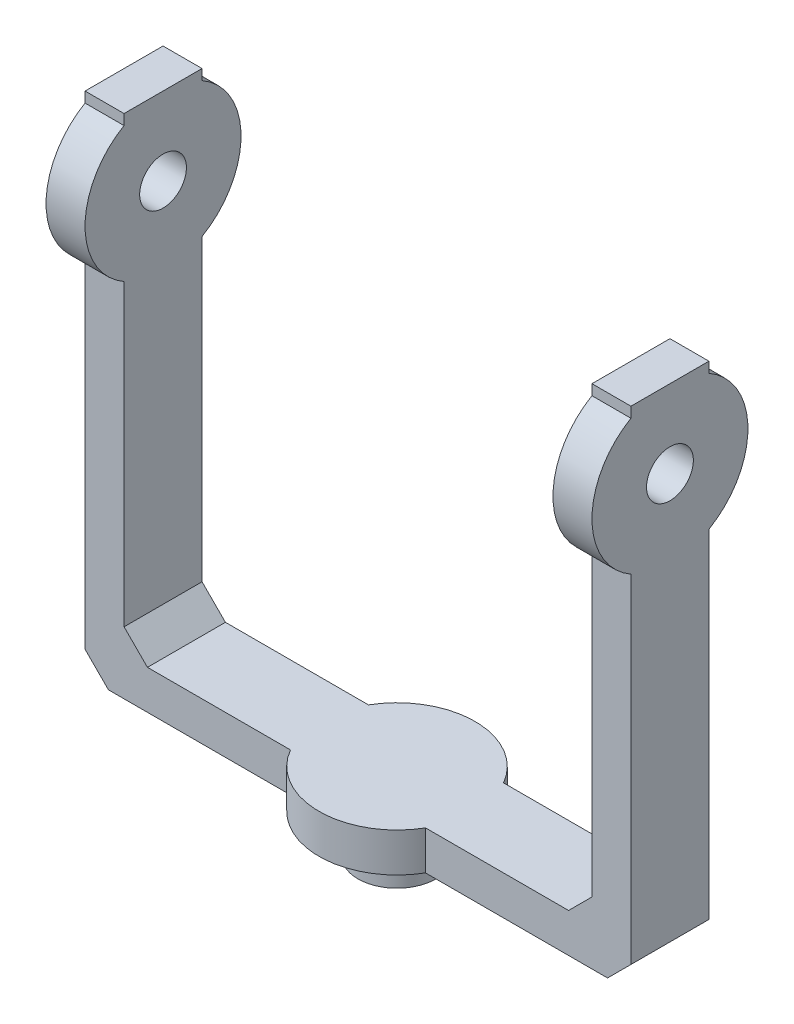
ISO-10303-21;
HEADER;
FILE_DESCRIPTION(('STEP AP214'),'2;1');
FILE_NAME('part.step','',(''),(''),'','','');
FILE_SCHEMA(('AUTOMOTIVE_DESIGN { 1 0 10303 214 1 1 1 1 }'));
ENDSEC;
DATA;
#1=APPLICATION_CONTEXT('core data for automotive mechanical design processes');
#2=APPLICATION_PROTOCOL_DEFINITION('international standard','automotive_design',2000,#1);
#3=PRODUCT_CONTEXT('',#1,'mechanical');
#4=PRODUCT('Part','Part','',(#3));
#5=PRODUCT_RELATED_PRODUCT_CATEGORY('part','',(#4));
#6=PRODUCT_DEFINITION_FORMATION('','',#4);
#7=PRODUCT_DEFINITION_CONTEXT('part definition',#1,'design');
#8=PRODUCT_DEFINITION('design','',#6,#7);
#9=PRODUCT_DEFINITION_SHAPE('','',#8);
#10=(LENGTH_UNIT() NAMED_UNIT(*) SI_UNIT(.MILLI.,.METRE.));
#11=(NAMED_UNIT(*) PLANE_ANGLE_UNIT() SI_UNIT($,.RADIAN.));
#12=(NAMED_UNIT(*) SI_UNIT($,.STERADIAN.) SOLID_ANGLE_UNIT());
#13=UNCERTAINTY_MEASURE_WITH_UNIT(LENGTH_MEASURE(1.E-05),#10,'distance_accuracy_value','');
#14=(GEOMETRIC_REPRESENTATION_CONTEXT(3) GLOBAL_UNCERTAINTY_ASSIGNED_CONTEXT((#13)) GLOBAL_UNIT_ASSIGNED_CONTEXT((#10,
#11,#12)) REPRESENTATION_CONTEXT('',''));
#15=CARTESIAN_POINT('',(0.,0.,0.));
#16=DIRECTION('',(0.,0.,1.));
#17=DIRECTION('',(1.,0.,0.));
#18=AXIS2_PLACEMENT_3D('',#15,#16,#17);
#19=CARTESIAN_POINT('',(-433.012701892219,500.,250.));
#20=DIRECTION('',(0.,0.,-1.));
#21=DIRECTION('',(-1.,0.,0.));
#22=AXIS2_PLACEMENT_3D('',#19,#20,#21);
#23=PLANE('',#22);
#24=DIRECTION('',(1.,0.,0.));
#25=VECTOR('',#24,1.);
#26=CARTESIAN_POINT('',(-1750.,3433.01270189222,250.));
#27=LINE('',#26,#25);
#28=CARTESIAN_POINT('',(-1500.,3433.01270189222,250.));
#29=VERTEX_POINT('',#28);
#30=CARTESIAN_POINT('',(-1750.,3433.01270189222,250.));
#31=VERTEX_POINT('',#30);
#32=EDGE_CURVE('E215',#29,#31,#27,.F.);
#33=ORIENTED_EDGE('',*,*,#32,.F.);
#34=DIRECTION('',(0.,-1.,0.));
#35=VECTOR('',#34,1.);
#36=CARTESIAN_POINT('',(-1500.,3500.,250.));
#37=LINE('',#36,#35);
#38=CARTESIAN_POINT('',(-1500.,3500.,250.));
#39=VERTEX_POINT('',#38);
#40=EDGE_CURVE('E231',#39,#29,#37,.T.);
#41=ORIENTED_EDGE('',*,*,#40,.F.);
#42=DIRECTION('',(-1.,0.,0.));
#43=VECTOR('',#42,1.);
#44=CARTESIAN_POINT('',(-1500.,3500.,250.));
#45=LINE('',#44,#43);
#46=CARTESIAN_POINT('',(-1750.,3500.,250.));
#47=VERTEX_POINT('',#46);
#48=EDGE_CURVE('E249',#39,#47,#45,.T.);
#49=ORIENTED_EDGE('',*,*,#48,.T.);
#50=DIRECTION('',(0.,-1.,0.));
#51=VECTOR('',#50,1.);
#52=CARTESIAN_POINT('',(-1750.,3500.,250.));
#53=LINE('',#52,#51);
#54=EDGE_CURVE('E233',#47,#31,#53,.T.);
#55=ORIENTED_EDGE('',*,*,#54,.T.);
#56=EDGE_LOOP('',(#33,#41,#49,#55));
#57=FACE_BOUND('',#56,.T.);
#58=ADVANCED_FACE('F49',(#57),#23,.F.);
#59=CARTESIAN_POINT('',(-1750.,2566.98729810778,250.));
#60=VERTEX_POINT('',#59);
#61=CARTESIAN_POINT('',(-1750.,400.,250.));
#62=VERTEX_POINT('',#61);
#63=EDGE_CURVE('E240',#60,#62,#53,.T.);
#64=ORIENTED_EDGE('',*,*,#63,.T.);
#65=DIRECTION('',(0.707106781186546,-0.707106781186549,0.));
#66=VECTOR('',#65,1.);
#67=CARTESIAN_POINT('',(-1600.,250.,250.));
#68=LINE('',#67,#66);
#69=CARTESIAN_POINT('',(-1600.,250.,250.));
#70=VERTEX_POINT('',#69);
#71=EDGE_CURVE('E403',#62,#70,#68,.T.);
#72=ORIENTED_EDGE('',*,*,#71,.T.);
#73=DIRECTION('',(1.,0.,0.));
#74=VECTOR('',#73,1.);
#75=CARTESIAN_POINT('',(-433.012701892219,250.,250.));
#76=LINE('',#75,#74);
#77=CARTESIAN_POINT('',(-433.012701892219,250.,250.));
#78=VERTEX_POINT('',#77);
#79=EDGE_CURVE('E327',#70,#78,#76,.T.);
#80=ORIENTED_EDGE('',*,*,#79,.T.);
#81=DIRECTION('',(0.,-1.,0.));
#82=VECTOR('',#81,1.);
#83=CARTESIAN_POINT('',(-433.012701892219,500.,250.));
#84=LINE('',#83,#82);
#85=CARTESIAN_POINT('',(-433.012701892219,500.,250.));
#86=VERTEX_POINT('',#85);
#87=EDGE_CURVE('E378',#86,#78,#84,.T.);
#88=ORIENTED_EDGE('',*,*,#87,.F.);
#89=DIRECTION('',(1.,0.,0.));
#90=VECTOR('',#89,1.);
#91=CARTESIAN_POINT('',(-433.012701892219,500.,250.));
#92=LINE('',#91,#90);
#93=CARTESIAN_POINT('',(-1350.,500.,250.));
#94=VERTEX_POINT('',#93);
#95=EDGE_CURVE('E328',#94,#86,#92,.T.);
#96=ORIENTED_EDGE('',*,*,#95,.F.);
#97=DIRECTION('',(0.70710678118655,-0.707106781186545,0.));
#98=VECTOR('',#97,1.);
#99=CARTESIAN_POINT('',(-891.506350946106,41.5063509461102,250.));
#100=LINE('',#99,#98);
#101=CARTESIAN_POINT('',(-1500.,650.,250.));
#102=VERTEX_POINT('',#101);
#103=EDGE_CURVE('E427',#94,#102,#100,.F.);
#104=ORIENTED_EDGE('',*,*,#103,.T.);
#105=CARTESIAN_POINT('',(-1500.,2566.98729810778,250.));
#106=VERTEX_POINT('',#105);
#107=EDGE_CURVE('E241',#106,#102,#37,.T.);
#108=ORIENTED_EDGE('',*,*,#107,.F.);
#109=DIRECTION('',(1.,0.,0.));
#110=VECTOR('',#109,1.);
#111=CARTESIAN_POINT('',(-1750.,2566.98729810778,250.));
#112=LINE('',#111,#110);
#113=EDGE_CURVE('E218',#60,#106,#112,.T.);
#114=ORIENTED_EDGE('',*,*,#113,.F.);
#115=EDGE_LOOP('',(#64,#72,#80,#88,#96,#104,#108,#114));
#116=FACE_BOUND('',#115,.T.);
#117=ADVANCED_FACE('F613',(#116),#23,.F.);
#118=CARTESIAN_POINT('',(-433.012701892219,500.,-250.));
#119=DIRECTION('',(0.,0.,1.));
#120=DIRECTION('',(1.,0.,0.));
#121=AXIS2_PLACEMENT_3D('',#118,#119,#120);
#122=PLANE('',#121);
#123=DIRECTION('',(-1.,0.,0.));
#124=VECTOR('',#123,1.);
#125=CARTESIAN_POINT('',(-433.012701892219,250.,-250.));
#126=LINE('',#125,#124);
#127=CARTESIAN_POINT('',(-433.012701892219,250.,-250.));
#128=VERTEX_POINT('',#127);
#129=CARTESIAN_POINT('',(-1600.,250.,-250.));
#130=VERTEX_POINT('',#129);
#131=EDGE_CURVE('E332',#128,#130,#126,.T.);
#132=ORIENTED_EDGE('',*,*,#131,.T.);
#133=DIRECTION('',(-0.707106781186546,0.707106781186549,0.));
#134=VECTOR('',#133,1.);
#135=CARTESIAN_POINT('',(-1600.,250.,-250.));
#136=LINE('',#135,#134);
#137=CARTESIAN_POINT('',(-1750.,400.,-250.));
#138=VERTEX_POINT('',#137);
#139=EDGE_CURVE('E397',#130,#138,#136,.T.);
#140=ORIENTED_EDGE('',*,*,#139,.T.);
#141=DIRECTION('',(0.,-1.,0.));
#142=VECTOR('',#141,1.);
#143=CARTESIAN_POINT('',(-1750.,3500.,-250.));
#144=LINE('',#143,#142);
#145=CARTESIAN_POINT('',(-1750.,2566.98729810778,-250.));
#146=VERTEX_POINT('',#145);
#147=EDGE_CURVE('E254',#146,#138,#144,.T.);
#148=ORIENTED_EDGE('',*,*,#147,.F.);
#149=DIRECTION('',(1.,0.,0.));
#150=VECTOR('',#149,1.);
#151=CARTESIAN_POINT('',(-1750.,2566.98729810778,-250.));
#152=LINE('',#151,#150);
#153=CARTESIAN_POINT('',(-1500.,2566.98729810778,-250.));
#154=VERTEX_POINT('',#153);
#155=EDGE_CURVE('E554',#154,#146,#152,.F.);
#156=ORIENTED_EDGE('',*,*,#155,.F.);
#157=DIRECTION('',(0.,-1.,0.));
#158=VECTOR('',#157,1.);
#159=CARTESIAN_POINT('',(-1500.,3500.,-250.));
#160=LINE('',#159,#158);
#161=CARTESIAN_POINT('',(-1500.,650.,-250.));
#162=VERTEX_POINT('',#161);
#163=EDGE_CURVE('E259',#154,#162,#160,.T.);
#164=ORIENTED_EDGE('',*,*,#163,.T.);
#165=DIRECTION('',(-0.70710678118655,0.707106781186545,0.));
#166=VECTOR('',#165,1.);
#167=CARTESIAN_POINT('',(-891.506350946106,41.5063509461104,-250.));
#168=LINE('',#167,#166);
#169=CARTESIAN_POINT('',(-1350.,500.,-250.));
#170=VERTEX_POINT('',#169);
#171=EDGE_CURVE('E430',#162,#170,#168,.F.);
#172=ORIENTED_EDGE('',*,*,#171,.T.);
#173=DIRECTION('',(-1.,0.,0.));
#174=VECTOR('',#173,1.);
#175=CARTESIAN_POINT('',(-433.012701892219,500.,-250.));
#176=LINE('',#175,#174);
#177=CARTESIAN_POINT('',(-433.012701892219,500.,-250.));
#178=VERTEX_POINT('',#177);
#179=EDGE_CURVE('E345',#178,#170,#176,.T.);
#180=ORIENTED_EDGE('',*,*,#179,.F.);
#181=DIRECTION('',(0.,-1.,0.));
#182=VECTOR('',#181,1.);
#183=CARTESIAN_POINT('',(-433.012701892219,500.,-250.));
#184=LINE('',#183,#182);
#185=EDGE_CURVE('E349',#178,#128,#184,.T.);
#186=ORIENTED_EDGE('',*,*,#185,.T.);
#187=EDGE_LOOP('',(#132,#140,#148,#156,#164,#172,#180,#186));
#188=FACE_BOUND('',#187,.T.);
#189=ADVANCED_FACE('F619',(#188),#122,.F.);
#190=DIRECTION('',(1.,0.,0.));
#191=VECTOR('',#190,1.);
#192=CARTESIAN_POINT('',(-1750.,3433.01270189222,-250.));
#193=LINE('',#192,#191);
#194=CARTESIAN_POINT('',(-1750.,3433.01270189222,-250.));
#195=VERTEX_POINT('',#194);
#196=CARTESIAN_POINT('',(-1500.,3433.01270189222,-250.));
#197=VERTEX_POINT('',#196);
#198=EDGE_CURVE('E560',#195,#197,#193,.T.);
#199=ORIENTED_EDGE('',*,*,#198,.F.);
#200=CARTESIAN_POINT('',(-1750.,3500.,-250.));
#201=VERTEX_POINT('',#200);
#202=EDGE_CURVE('E255',#201,#195,#144,.T.);
#203=ORIENTED_EDGE('',*,*,#202,.F.);
#204=DIRECTION('',(1.,0.,0.));
#205=VECTOR('',#204,1.);
#206=CARTESIAN_POINT('',(-1500.,3500.,-250.));
#207=LINE('',#206,#205);
#208=CARTESIAN_POINT('',(-1500.,3500.,-250.));
#209=VERTEX_POINT('',#208);
#210=EDGE_CURVE('E539',#201,#209,#207,.T.);
#211=ORIENTED_EDGE('',*,*,#210,.T.);
#212=EDGE_CURVE('E260',#209,#197,#160,.T.);
#213=ORIENTED_EDGE('',*,*,#212,.T.);
#214=EDGE_LOOP('',(#199,#203,#211,#213));
#215=FACE_BOUND('',#214,.T.);
#216=ADVANCED_FACE('F735',(#215),#122,.F.);
#217=CARTESIAN_POINT('',(1500.,500.,250.));
#218=DIRECTION('',(0.,0.,-1.));
#219=DIRECTION('',(-1.,0.,0.));
#220=AXIS2_PLACEMENT_3D('',#217,#218,#219);
#221=PLANE('',#220);
#222=DIRECTION('',(1.,0.,0.));
#223=VECTOR('',#222,1.);
#224=CARTESIAN_POINT('',(1500.,250.,250.));
#225=LINE('',#224,#223);
#226=CARTESIAN_POINT('',(433.012701892219,250.,250.));
#227=VERTEX_POINT('',#226);
#228=CARTESIAN_POINT('',(1600.,250.,250.));
#229=VERTEX_POINT('',#228);
#230=EDGE_CURVE('E355',#227,#229,#225,.T.);
#231=ORIENTED_EDGE('',*,*,#230,.T.);
#232=DIRECTION('',(-0.707106781186549,-0.707106781186546,0.));
#233=VECTOR('',#232,1.);
#234=CARTESIAN_POINT('',(1750.,400.,250.));
#235=LINE('',#234,#233);
#236=CARTESIAN_POINT('',(1750.,400.,250.));
#237=VERTEX_POINT('',#236);
#238=EDGE_CURVE('E66',#229,#237,#235,.F.);
#239=ORIENTED_EDGE('',*,*,#238,.T.);
#240=DIRECTION('',(0.,-1.,0.));
#241=VECTOR('',#240,1.);
#242=CARTESIAN_POINT('',(1750.,3500.,250.));
#243=LINE('',#242,#241);
#244=CARTESIAN_POINT('',(1750.,2566.98729810778,250.));
#245=VERTEX_POINT('',#244);
#246=EDGE_CURVE('E318',#245,#237,#243,.T.);
#247=ORIENTED_EDGE('',*,*,#246,.F.);
#248=DIRECTION('',(-1.,0.,0.));
#249=VECTOR('',#248,1.);
#250=CARTESIAN_POINT('',(1750.,2566.98729810778,250.));
#251=LINE('',#250,#249);
#252=CARTESIAN_POINT('',(1500.,2566.98729810778,250.));
#253=VERTEX_POINT('',#252);
#254=EDGE_CURVE('E292',#245,#253,#251,.T.);
#255=ORIENTED_EDGE('',*,*,#254,.T.);
#256=DIRECTION('',(0.,-1.,0.));
#257=VECTOR('',#256,1.);
#258=CARTESIAN_POINT('',(1500.,3500.,250.));
#259=LINE('',#258,#257);
#260=CARTESIAN_POINT('',(1500.,650.,250.));
#261=VERTEX_POINT('',#260);
#262=EDGE_CURVE('E323',#253,#261,#259,.T.);
#263=ORIENTED_EDGE('',*,*,#262,.T.);
#264=DIRECTION('',(-0.70710678118655,-0.707106781186545,0.));
#265=VECTOR('',#264,1.);
#266=CARTESIAN_POINT('',(1425.,575.000000000001,250.));
#267=LINE('',#266,#265);
#268=CARTESIAN_POINT('',(1350.,500.,250.));
#269=VERTEX_POINT('',#268);
#270=EDGE_CURVE('E11',#261,#269,#267,.T.);
#271=ORIENTED_EDGE('',*,*,#270,.T.);
#272=DIRECTION('',(1.,0.,0.));
#273=VECTOR('',#272,1.);
#274=CARTESIAN_POINT('',(1500.,500.,250.));
#275=LINE('',#274,#273);
#276=CARTESIAN_POINT('',(433.012701892219,500.,250.));
#277=VERTEX_POINT('',#276);
#278=EDGE_CURVE('E335',#277,#269,#275,.T.);
#279=ORIENTED_EDGE('',*,*,#278,.F.);
#280=DIRECTION('',(0.,-1.,0.));
#281=VECTOR('',#280,1.);
#282=CARTESIAN_POINT('',(433.012701892219,500.,250.));
#283=LINE('',#282,#281);
#284=EDGE_CURVE('E374',#277,#227,#283,.T.);
#285=ORIENTED_EDGE('',*,*,#284,.T.);
#286=EDGE_LOOP('',(#231,#239,#247,#255,#263,#271,#279,#285));
#287=FACE_BOUND('',#286,.T.);
#288=ADVANCED_FACE('F453',(#287),#221,.F.);
#289=CARTESIAN_POINT('',(1500.,500.,-250.));
#290=DIRECTION('',(0.,0.,1.));
#291=DIRECTION('',(1.,0.,0.));
#292=AXIS2_PLACEMENT_3D('',#289,#290,#291);
#293=PLANE('',#292);
#294=DIRECTION('',(0.,-1.,0.));
#295=VECTOR('',#294,1.);
#296=CARTESIAN_POINT('',(1750.,3500.,-250.));
#297=LINE('',#296,#295);
#298=CARTESIAN_POINT('',(1750.,3500.,-250.));
#299=VERTEX_POINT('',#298);
#300=CARTESIAN_POINT('',(1750.,3433.01270189222,-250.));
#301=VERTEX_POINT('',#300);
#302=EDGE_CURVE('E314',#299,#301,#297,.T.);
#303=ORIENTED_EDGE('',*,*,#302,.T.);
#304=DIRECTION('',(-1.,0.,0.));
#305=VECTOR('',#304,1.);
#306=CARTESIAN_POINT('',(1750.,3433.01270189222,-250.));
#307=LINE('',#306,#305);
#308=CARTESIAN_POINT('',(1500.,3433.01270189222,-250.));
#309=VERTEX_POINT('',#308);
#310=EDGE_CURVE('E285',#301,#309,#307,.T.);
#311=ORIENTED_EDGE('',*,*,#310,.T.);
#312=DIRECTION('',(0.,-1.,0.));
#313=VECTOR('',#312,1.);
#314=CARTESIAN_POINT('',(1500.,3500.,-250.));
#315=LINE('',#314,#313);
#316=CARTESIAN_POINT('',(1500.,3500.,-250.));
#317=VERTEX_POINT('',#316);
#318=EDGE_CURVE('E309',#317,#309,#315,.T.);
#319=ORIENTED_EDGE('',*,*,#318,.F.);
#320=DIRECTION('',(-1.,0.,0.));
#321=VECTOR('',#320,1.);
#322=CARTESIAN_POINT('',(1500.,3500.,-250.));
#323=LINE('',#322,#321);
#324=EDGE_CURVE('E305',#299,#317,#323,.T.);
#325=ORIENTED_EDGE('',*,*,#324,.F.);
#326=EDGE_LOOP('',(#303,#311,#319,#325));
#327=FACE_BOUND('',#326,.T.);
#328=ADVANCED_FACE('F630',(#327),#293,.F.);
#329=CARTESIAN_POINT('',(0.,250.,0.));
#330=DIRECTION('',(0.,-1.,0.));
#331=DIRECTION('',(0.,0.,-1.));
#332=AXIS2_PLACEMENT_3D('',#329,#330,#331);
#333=CYLINDRICAL_SURFACE('',#332,250.);
#334=CARTESIAN_POINT('',(0.,250.,0.));
#335=DIRECTION('',(0.,1.,0.));
#336=DIRECTION('',(0.,0.,1.));
#337=AXIS2_PLACEMENT_3D('',#334,#335,#336);
#338=CIRCLE('',#337,250.);
#339=CARTESIAN_POINT('',(0.,250.,250.));
#340=VERTEX_POINT('',#339);
#341=EDGE_CURVE('E383',#340,#340,#338,.T.);
#342=ORIENTED_EDGE('',*,*,#341,.F.);
#343=EDGE_LOOP('',(#342));
#344=FACE_BOUND('',#343,.T.);
#345=CARTESIAN_POINT('',(0.,0.,0.));
#346=DIRECTION('',(0.,1.,0.));
#347=DIRECTION('',(0.,0.,1.));
#348=AXIS2_PLACEMENT_3D('',#345,#346,#347);
#349=CIRCLE('',#348,250.);
#350=CARTESIAN_POINT('',(0.,0.,250.));
#351=VERTEX_POINT('',#350);
#352=EDGE_CURVE('E382',#351,#351,#349,.T.);
#353=ORIENTED_EDGE('',*,*,#352,.T.);
#354=EDGE_LOOP('',(#353));
#355=FACE_BOUND('',#354,.T.);
#356=ADVANCED_FACE('F627',(#344,#355),#333,.T.);
#357=CARTESIAN_POINT('',(0.,0.,0.));
#358=DIRECTION('',(0.,1.,0.));
#359=DIRECTION('',(0.,0.,1.));
#360=AXIS2_PLACEMENT_3D('',#357,#358,#359);
#361=PLANE('',#360);
#362=ORIENTED_EDGE('',*,*,#352,.F.);
#363=EDGE_LOOP('',(#362));
#364=FACE_BOUND('',#363,.T.);
#365=ADVANCED_FACE('F624',(#364),#361,.F.);
#366=CARTESIAN_POINT('',(0.,500.,0.));
#367=DIRECTION('',(0.,-1.,0.));
#368=DIRECTION('',(0.,0.,-1.));
#369=AXIS2_PLACEMENT_3D('',#366,#367,#368);
#370=CYLINDRICAL_SURFACE('',#369,500.);
#371=CARTESIAN_POINT('',(0.,250.,0.));
#372=DIRECTION('',(0.,1.,0.));
#373=DIRECTION('',(0.,0.,1.));
#374=AXIS2_PLACEMENT_3D('',#371,#372,#373);
#375=CIRCLE('',#374,500.);
#376=EDGE_CURVE('E352',#78,#227,#375,.T.);
#377=ORIENTED_EDGE('',*,*,#376,.T.);
#378=ORIENTED_EDGE('',*,*,#284,.F.);
#379=CARTESIAN_POINT('',(0.,500.,0.));
#380=DIRECTION('',(0.,1.,0.));
#381=DIRECTION('',(0.,0.,1.));
#382=AXIS2_PLACEMENT_3D('',#379,#380,#381);
#383=CIRCLE('',#382,500.);
#384=EDGE_CURVE('E331',#86,#277,#383,.T.);
#385=ORIENTED_EDGE('',*,*,#384,.F.);
#386=ORIENTED_EDGE('',*,*,#87,.T.);
#387=EDGE_LOOP('',(#377,#378,#385,#386));
#388=FACE_BOUND('',#387,.T.);
#389=ADVANCED_FACE('F461',(#388),#370,.T.);
#390=CARTESIAN_POINT('',(1500.,3500.,250.));
#391=VERTEX_POINT('',#390);
#392=CARTESIAN_POINT('',(1500.,3433.01270189222,250.));
#393=VERTEX_POINT('',#392);
#394=EDGE_CURVE('E324',#391,#393,#259,.T.);
#395=ORIENTED_EDGE('',*,*,#394,.T.);
#396=DIRECTION('',(-1.,0.,0.));
#397=VECTOR('',#396,1.);
#398=CARTESIAN_POINT('',(1750.,3433.01270189222,250.));
#399=LINE('',#398,#397);
#400=CARTESIAN_POINT('',(1750.,3433.01270189222,250.));
#401=VERTEX_POINT('',#400);
#402=EDGE_CURVE('E289',#393,#401,#399,.F.);
#403=ORIENTED_EDGE('',*,*,#402,.T.);
#404=CARTESIAN_POINT('',(1750.,3500.,250.));
#405=VERTEX_POINT('',#404);
#406=EDGE_CURVE('E319',#405,#401,#243,.T.);
#407=ORIENTED_EDGE('',*,*,#406,.F.);
#408=DIRECTION('',(1.,0.,0.));
#409=VECTOR('',#408,1.);
#410=CARTESIAN_POINT('',(1500.,3500.,250.));
#411=LINE('',#410,#409);
#412=EDGE_CURVE('E299',#391,#405,#411,.T.);
#413=ORIENTED_EDGE('',*,*,#412,.F.);
#414=EDGE_LOOP('',(#395,#403,#407,#413));
#415=FACE_BOUND('',#414,.T.);
#416=ADVANCED_FACE('F788',(#415),#221,.F.);
#417=CARTESIAN_POINT('',(1750.,2566.98729810778,-250.));
#418=VERTEX_POINT('',#417);
#419=CARTESIAN_POINT('',(1750.,400.,-250.));
#420=VERTEX_POINT('',#419);
#421=EDGE_CURVE('E313',#418,#420,#297,.T.);
#422=ORIENTED_EDGE('',*,*,#421,.T.);
#423=DIRECTION('',(0.707106781186549,0.707106781186546,0.));
#424=VECTOR('',#423,1.);
#425=CARTESIAN_POINT('',(1750.,400.,-250.));
#426=LINE('',#425,#424);
#427=CARTESIAN_POINT('',(1600.,250.,-250.));
#428=VERTEX_POINT('',#427);
#429=EDGE_CURVE('E74',#420,#428,#426,.F.);
#430=ORIENTED_EDGE('',*,*,#429,.T.);
#431=DIRECTION('',(-1.,0.,0.));
#432=VECTOR('',#431,1.);
#433=CARTESIAN_POINT('',(1500.,250.,-250.));
#434=LINE('',#433,#432);
#435=CARTESIAN_POINT('',(433.012701892219,250.,-250.));
#436=VERTEX_POINT('',#435);
#437=EDGE_CURVE('E358',#428,#436,#434,.T.);
#438=ORIENTED_EDGE('',*,*,#437,.T.);
#439=DIRECTION('',(0.,-1.,0.));
#440=VECTOR('',#439,1.);
#441=CARTESIAN_POINT('',(433.012701892219,500.,-250.));
#442=LINE('',#441,#440);
#443=CARTESIAN_POINT('',(433.012701892219,500.,-250.));
#444=VERTEX_POINT('',#443);
#445=EDGE_CURVE('E370',#444,#436,#442,.T.);
#446=ORIENTED_EDGE('',*,*,#445,.F.);
#447=DIRECTION('',(-1.,0.,0.));
#448=VECTOR('',#447,1.);
#449=CARTESIAN_POINT('',(1500.,500.,-250.));
#450=LINE('',#449,#448);
#451=CARTESIAN_POINT('',(1350.,500.,-250.));
#452=VERTEX_POINT('',#451);
#453=EDGE_CURVE('E339',#452,#444,#450,.T.);
#454=ORIENTED_EDGE('',*,*,#453,.F.);
#455=DIRECTION('',(0.70710678118655,0.707106781186545,0.));
#456=VECTOR('',#455,1.);
#457=CARTESIAN_POINT('',(1425.,575.000000000001,-250.));
#458=LINE('',#457,#456);
#459=CARTESIAN_POINT('',(1500.,650.,-250.));
#460=VERTEX_POINT('',#459);
#461=EDGE_CURVE('E59',#452,#460,#458,.T.);
#462=ORIENTED_EDGE('',*,*,#461,.T.);
#463=CARTESIAN_POINT('',(1500.,2566.98729810778,-250.));
#464=VERTEX_POINT('',#463);
#465=EDGE_CURVE('E308',#464,#460,#315,.T.);
#466=ORIENTED_EDGE('',*,*,#465,.F.);
#467=DIRECTION('',(-1.,0.,0.));
#468=VECTOR('',#467,1.);
#469=CARTESIAN_POINT('',(1750.,2566.98729810778,-250.));
#470=LINE('',#469,#468);
#471=EDGE_CURVE('E281',#464,#418,#470,.F.);
#472=ORIENTED_EDGE('',*,*,#471,.T.);
#473=EDGE_LOOP('',(#422,#430,#438,#446,#454,#462,#466,#472));
#474=FACE_BOUND('',#473,.T.);
#475=ADVANCED_FACE('F440',(#474),#293,.F.);
#476=CARTESIAN_POINT('',(0.,500.,0.));
#477=DIRECTION('',(0.,-1.,0.));
#478=DIRECTION('',(0.,0.,-1.));
#479=AXIS2_PLACEMENT_3D('',#476,#477,#478);
#480=CYLINDRICAL_SURFACE('',#479,500.);
#481=CARTESIAN_POINT('',(0.,250.,0.));
#482=DIRECTION('',(0.,1.,0.));
#483=DIRECTION('',(0.,0.,1.));
#484=AXIS2_PLACEMENT_3D('',#481,#482,#483);
#485=CIRCLE('',#484,500.);
#486=EDGE_CURVE('E361',#436,#128,#485,.T.);
#487=ORIENTED_EDGE('',*,*,#486,.T.);
#488=ORIENTED_EDGE('',*,*,#185,.F.);
#489=CARTESIAN_POINT('',(0.,500.,0.));
#490=DIRECTION('',(0.,1.,0.));
#491=DIRECTION('',(0.,0.,1.));
#492=AXIS2_PLACEMENT_3D('',#489,#490,#491);
#493=CIRCLE('',#492,500.);
#494=EDGE_CURVE('E342',#444,#178,#493,.T.);
#495=ORIENTED_EDGE('',*,*,#494,.F.);
#496=ORIENTED_EDGE('',*,*,#445,.T.);
#497=EDGE_LOOP('',(#487,#488,#495,#496));
#498=FACE_BOUND('',#497,.T.);
#499=ADVANCED_FACE('F844',(#498),#480,.T.);
#500=CARTESIAN_POINT('',(0.,500.,0.));
#501=DIRECTION('',(0.,1.,0.));
#502=DIRECTION('',(0.,0.,1.));
#503=AXIS2_PLACEMENT_3D('',#500,#501,#502);
#504=PLANE('',#503);
#505=ORIENTED_EDGE('',*,*,#179,.T.);
#506=DIRECTION('',(0.,0.,1.));
#507=VECTOR('',#506,1.);
#508=CARTESIAN_POINT('',(-1350.,500.,250.));
#509=LINE('',#508,#507);
#510=EDGE_CURVE('E410',#170,#94,#509,.T.);
#511=ORIENTED_EDGE('',*,*,#510,.T.);
#512=ORIENTED_EDGE('',*,*,#95,.T.);
#513=ORIENTED_EDGE('',*,*,#384,.T.);
#514=ORIENTED_EDGE('',*,*,#278,.T.);
#515=DIRECTION('',(0.,0.,-1.));
#516=VECTOR('',#515,1.);
#517=CARTESIAN_POINT('',(1350.,500.,0.));
#518=LINE('',#517,#516);
#519=EDGE_CURVE('E406',#269,#452,#518,.T.);
#520=ORIENTED_EDGE('',*,*,#519,.T.);
#521=ORIENTED_EDGE('',*,*,#453,.T.);
#522=ORIENTED_EDGE('',*,*,#494,.T.);
#523=EDGE_LOOP('',(#505,#511,#512,#513,#514,#520,#521,#522));
#524=FACE_BOUND('',#523,.T.);
#525=ADVANCED_FACE('F455',(#524),#504,.T.);
#526=CARTESIAN_POINT('',(0.,250.,0.));
#527=DIRECTION('',(0.,1.,0.));
#528=DIRECTION('',(0.,0.,1.));
#529=AXIS2_PLACEMENT_3D('',#526,#527,#528);
#530=PLANE('',#529);
#531=ORIENTED_EDGE('',*,*,#341,.T.);
#532=EDGE_LOOP('',(#531));
#533=FACE_BOUND('',#532,.T.);
#534=ORIENTED_EDGE('',*,*,#79,.F.);
#535=DIRECTION('',(0.,0.,-1.));
#536=VECTOR('',#535,1.);
#537=CARTESIAN_POINT('',(-1600.,250.,-250.));
#538=LINE('',#537,#536);
#539=EDGE_CURVE('E393',#70,#130,#538,.T.);
#540=ORIENTED_EDGE('',*,*,#539,.T.);
#541=ORIENTED_EDGE('',*,*,#131,.F.);
#542=ORIENTED_EDGE('',*,*,#486,.F.);
#543=ORIENTED_EDGE('',*,*,#437,.F.);
#544=DIRECTION('',(0.,0.,1.));
#545=VECTOR('',#544,1.);
#546=CARTESIAN_POINT('',(1600.,250.,0.));
#547=LINE('',#546,#545);
#548=EDGE_CURVE('E387',#428,#229,#547,.T.);
#549=ORIENTED_EDGE('',*,*,#548,.T.);
#550=ORIENTED_EDGE('',*,*,#230,.F.);
#551=ORIENTED_EDGE('',*,*,#376,.F.);
#552=EDGE_LOOP('',(#534,#540,#541,#542,#543,#549,#550,#551));
#553=FACE_BOUND('',#552,.T.);
#554=ADVANCED_FACE('F466',(#533,#553),#530,.F.);
#555=CARTESIAN_POINT('',(1500.,3500.,-250.));
#556=DIRECTION('',(1.,0.,0.));
#557=DIRECTION('',(0.,0.,-1.));
#558=AXIS2_PLACEMENT_3D('',#555,#556,#557);
#559=PLANE('',#558);
#560=CARTESIAN_POINT('',(1500.,3000.,0.));
#561=DIRECTION('',(-1.,0.,0.));
#562=DIRECTION('',(0.,0.,1.));
#563=AXIS2_PLACEMENT_3D('',#560,#561,#562);
#564=CIRCLE('',#563,150.);
#565=CARTESIAN_POINT('',(1500.,3000.,150.));
#566=VERTEX_POINT('',#565);
#567=EDGE_CURVE('E263',#566,#566,#564,.T.);
#568=ORIENTED_EDGE('',*,*,#567,.F.);
#569=EDGE_LOOP('',(#568));
#570=FACE_BOUND('',#569,.T.);
#571=ORIENTED_EDGE('',*,*,#465,.T.);
#572=DIRECTION('',(0.,0.,1.));
#573=VECTOR('',#572,1.);
#574=CARTESIAN_POINT('',(1500.,650.,-250.));
#575=LINE('',#574,#573);
#576=EDGE_CURVE('E417',#460,#261,#575,.T.);
#577=ORIENTED_EDGE('',*,*,#576,.T.);
#578=ORIENTED_EDGE('',*,*,#262,.F.);
#579=CARTESIAN_POINT('',(1500.,3000.,0.));
#580=DIRECTION('',(-1.,0.,0.));
#581=DIRECTION('',(0.,0.,1.));
#582=AXIS2_PLACEMENT_3D('',#579,#580,#581);
#583=CIRCLE('',#582,500.);
#584=EDGE_CURVE('E268',#253,#393,#583,.T.);
#585=ORIENTED_EDGE('',*,*,#584,.T.);
#586=ORIENTED_EDGE('',*,*,#394,.F.);
#587=DIRECTION('',(0.,0.,1.));
#588=VECTOR('',#587,1.);
#589=CARTESIAN_POINT('',(1500.,3500.,-250.));
#590=LINE('',#589,#588);
#591=EDGE_CURVE('E296',#317,#391,#590,.T.);
#592=ORIENTED_EDGE('',*,*,#591,.F.);
#593=ORIENTED_EDGE('',*,*,#318,.T.);
#594=EDGE_CURVE('E277',#309,#464,#583,.T.);
#595=ORIENTED_EDGE('',*,*,#594,.T.);
#596=EDGE_LOOP('',(#571,#577,#578,#585,#586,#592,#593,#595));
#597=FACE_BOUND('',#596,.T.);
#598=ADVANCED_FACE('F446',(#570,#597),#559,.F.);
#599=CARTESIAN_POINT('',(1750.,3500.,-250.));
#600=DIRECTION('',(-1.,0.,0.));
#601=DIRECTION('',(0.,0.,1.));
#602=AXIS2_PLACEMENT_3D('',#599,#600,#601);
#603=PLANE('',#602);
#604=CARTESIAN_POINT('',(1750.,3000.,0.));
#605=DIRECTION('',(-1.,0.,0.));
#606=DIRECTION('',(0.,0.,1.));
#607=AXIS2_PLACEMENT_3D('',#604,#605,#606);
#608=CIRCLE('',#607,150.);
#609=CARTESIAN_POINT('',(1750.,3000.,150.));
#610=VERTEX_POINT('',#609);
#611=EDGE_CURVE('E264',#610,#610,#608,.T.);
#612=ORIENTED_EDGE('',*,*,#611,.T.);
#613=EDGE_LOOP('',(#612));
#614=FACE_BOUND('',#613,.T.);
#615=ORIENTED_EDGE('',*,*,#246,.T.);
#616=DIRECTION('',(0.,0.,-1.));
#617=VECTOR('',#616,1.);
#618=CARTESIAN_POINT('',(1750.,400.,-250.));
#619=LINE('',#618,#617);
#620=EDGE_CURVE('E420',#237,#420,#619,.T.);
#621=ORIENTED_EDGE('',*,*,#620,.T.);
#622=ORIENTED_EDGE('',*,*,#421,.F.);
#623=CARTESIAN_POINT('',(1750.,3000.,0.));
#624=DIRECTION('',(-1.,0.,0.));
#625=DIRECTION('',(0.,0.,1.));
#626=AXIS2_PLACEMENT_3D('',#623,#624,#625);
#627=CIRCLE('',#626,500.);
#628=EDGE_CURVE('E276',#301,#418,#627,.T.);
#629=ORIENTED_EDGE('',*,*,#628,.F.);
#630=ORIENTED_EDGE('',*,*,#302,.F.);
#631=DIRECTION('',(0.,0.,-1.));
#632=VECTOR('',#631,1.);
#633=CARTESIAN_POINT('',(1750.,3500.,-250.));
#634=LINE('',#633,#632);
#635=EDGE_CURVE('E302',#405,#299,#634,.T.);
#636=ORIENTED_EDGE('',*,*,#635,.F.);
#637=ORIENTED_EDGE('',*,*,#406,.T.);
#638=EDGE_CURVE('E272',#245,#401,#627,.T.);
#639=ORIENTED_EDGE('',*,*,#638,.F.);
#640=EDGE_LOOP('',(#615,#621,#622,#629,#630,#636,#637,#639));
#641=FACE_BOUND('',#640,.T.);
#642=ADVANCED_FACE('F471',(#614,#641),#603,.F.);
#643=CARTESIAN_POINT('',(0.,3500.,0.));
#644=DIRECTION('',(0.,1.,0.));
#645=DIRECTION('',(0.,0.,1.));
#646=AXIS2_PLACEMENT_3D('',#643,#644,#645);
#647=PLANE('',#646);
#648=ORIENTED_EDGE('',*,*,#591,.T.);
#649=ORIENTED_EDGE('',*,*,#412,.T.);
#650=ORIENTED_EDGE('',*,*,#635,.T.);
#651=ORIENTED_EDGE('',*,*,#324,.T.);
#652=EDGE_LOOP('',(#648,#649,#650,#651));
#653=FACE_BOUND('',#652,.T.);
#654=ADVANCED_FACE('F780',(#653),#647,.T.);
#655=CARTESIAN_POINT('',(1750.,3000.,0.));
#656=DIRECTION('',(-1.,0.,0.));
#657=DIRECTION('',(0.,0.,1.));
#658=AXIS2_PLACEMENT_3D('',#655,#656,#657);
#659=CYLINDRICAL_SURFACE('',#658,500.);
#660=ORIENTED_EDGE('',*,*,#310,.F.);
#661=ORIENTED_EDGE('',*,*,#628,.T.);
#662=ORIENTED_EDGE('',*,*,#471,.F.);
#663=ORIENTED_EDGE('',*,*,#594,.F.);
#664=EDGE_LOOP('',(#660,#661,#662,#663));
#665=FACE_BOUND('',#664,.T.);
#666=ADVANCED_FACE('F771',(#665),#659,.T.);
#667=ORIENTED_EDGE('',*,*,#254,.F.);
#668=ORIENTED_EDGE('',*,*,#638,.T.);
#669=ORIENTED_EDGE('',*,*,#402,.F.);
#670=ORIENTED_EDGE('',*,*,#584,.F.);
#671=EDGE_LOOP('',(#667,#668,#669,#670));
#672=FACE_BOUND('',#671,.T.);
#673=ADVANCED_FACE('F762',(#672),#659,.T.);
#674=CARTESIAN_POINT('',(1750.,3000.,0.));
#675=DIRECTION('',(-1.,0.,0.));
#676=DIRECTION('',(0.,0.,1.));
#677=AXIS2_PLACEMENT_3D('',#674,#675,#676);
#678=CYLINDRICAL_SURFACE('',#677,150.);
#679=ORIENTED_EDGE('',*,*,#611,.F.);
#680=EDGE_LOOP('',(#679));
#681=FACE_BOUND('',#680,.T.);
#682=ORIENTED_EDGE('',*,*,#567,.T.);
#683=EDGE_LOOP('',(#682));
#684=FACE_BOUND('',#683,.T.);
#685=ADVANCED_FACE('F709',(#681,#684),#678,.F.);
#686=CARTESIAN_POINT('',(-1500.,3500.,-250.));
#687=DIRECTION('',(1.,0.,0.));
#688=DIRECTION('',(0.,0.,-1.));
#689=AXIS2_PLACEMENT_3D('',#686,#687,#688);
#690=PLANE('',#689);
#691=CARTESIAN_POINT('',(-1500.,3000.,0.));
#692=DIRECTION('',(-1.,0.,0.));
#693=DIRECTION('',(0.,0.,1.));
#694=AXIS2_PLACEMENT_3D('',#691,#692,#693);
#695=CIRCLE('',#694,150.);
#696=CARTESIAN_POINT('',(-1500.,3000.,150.));
#697=VERTEX_POINT('',#696);
#698=EDGE_CURVE('E587',#697,#697,#695,.T.);
#699=ORIENTED_EDGE('',*,*,#698,.T.);
#700=EDGE_LOOP('',(#699));
#701=FACE_BOUND('',#700,.T.);
#702=ORIENTED_EDGE('',*,*,#107,.T.);
#703=DIRECTION('',(0.,0.,-1.));
#704=VECTOR('',#703,1.);
#705=CARTESIAN_POINT('',(-1500.,650.,-250.));
#706=LINE('',#705,#704);
#707=EDGE_CURVE('E414',#102,#162,#706,.T.);
#708=ORIENTED_EDGE('',*,*,#707,.T.);
#709=ORIENTED_EDGE('',*,*,#163,.F.);
#710=CARTESIAN_POINT('',(-1500.,3000.,0.));
#711=DIRECTION('',(-1.,0.,0.));
#712=DIRECTION('',(0.,0.,1.));
#713=AXIS2_PLACEMENT_3D('',#710,#711,#712);
#714=CIRCLE('',#713,500.);
#715=EDGE_CURVE('E224',#197,#154,#714,.T.);
#716=ORIENTED_EDGE('',*,*,#715,.F.);
#717=ORIENTED_EDGE('',*,*,#212,.F.);
#718=DIRECTION('',(0.,0.,1.));
#719=VECTOR('',#718,1.);
#720=CARTESIAN_POINT('',(-1500.,3500.,-250.));
#721=LINE('',#720,#719);
#722=EDGE_CURVE('E235',#209,#39,#721,.T.);
#723=ORIENTED_EDGE('',*,*,#722,.T.);
#724=ORIENTED_EDGE('',*,*,#40,.T.);
#725=EDGE_CURVE('E212',#106,#29,#714,.T.);
#726=ORIENTED_EDGE('',*,*,#725,.F.);
#727=EDGE_LOOP('',(#702,#708,#709,#716,#717,#723,#724,#726));
#728=FACE_BOUND('',#727,.T.);
#729=ADVANCED_FACE('F237',(#701,#728),#690,.T.);
#730=CARTESIAN_POINT('',(-1750.,3500.,-250.));
#731=DIRECTION('',(-1.,0.,0.));
#732=DIRECTION('',(0.,0.,1.));
#733=AXIS2_PLACEMENT_3D('',#730,#731,#732);
#734=PLANE('',#733);
#735=CARTESIAN_POINT('',(-1750.,3000.,0.));
#736=DIRECTION('',(-1.,0.,0.));
#737=DIRECTION('',(0.,0.,1.));
#738=AXIS2_PLACEMENT_3D('',#735,#736,#737);
#739=CIRCLE('',#738,150.);
#740=CARTESIAN_POINT('',(-1750.,3000.,150.));
#741=VERTEX_POINT('',#740);
#742=EDGE_CURVE('E225',#741,#741,#739,.T.);
#743=ORIENTED_EDGE('',*,*,#742,.F.);
#744=EDGE_LOOP('',(#743));
#745=FACE_BOUND('',#744,.T.);
#746=ORIENTED_EDGE('',*,*,#147,.T.);
#747=DIRECTION('',(0.,0.,1.));
#748=VECTOR('',#747,1.);
#749=CARTESIAN_POINT('',(-1750.,400.,250.));
#750=LINE('',#749,#748);
#751=EDGE_CURVE('E400',#138,#62,#750,.T.);
#752=ORIENTED_EDGE('',*,*,#751,.T.);
#753=ORIENTED_EDGE('',*,*,#63,.F.);
#754=CARTESIAN_POINT('',(-1750.,3000.,0.));
#755=DIRECTION('',(-1.,0.,0.));
#756=DIRECTION('',(0.,0.,1.));
#757=AXIS2_PLACEMENT_3D('',#754,#755,#756);
#758=CIRCLE('',#757,500.);
#759=EDGE_CURVE('E572',#60,#31,#758,.T.);
#760=ORIENTED_EDGE('',*,*,#759,.T.);
#761=ORIENTED_EDGE('',*,*,#54,.F.);
#762=DIRECTION('',(0.,0.,-1.));
#763=VECTOR('',#762,1.);
#764=CARTESIAN_POINT('',(-1750.,3500.,-250.));
#765=LINE('',#764,#763);
#766=EDGE_CURVE('E535',#47,#201,#765,.T.);
#767=ORIENTED_EDGE('',*,*,#766,.T.);
#768=ORIENTED_EDGE('',*,*,#202,.T.);
#769=EDGE_CURVE('E566',#195,#146,#758,.T.);
#770=ORIENTED_EDGE('',*,*,#769,.T.);
#771=EDGE_LOOP('',(#746,#752,#753,#760,#761,#767,#768,#770));
#772=FACE_BOUND('',#771,.T.);
#773=ADVANCED_FACE('F692',(#745,#772),#734,.T.);
#774=CARTESIAN_POINT('',(0.,3500.,0.));
#775=DIRECTION('',(0.,1.,0.));
#776=DIRECTION('',(0.,0.,1.));
#777=AXIS2_PLACEMENT_3D('',#774,#775,#776);
#778=PLANE('',#777);
#779=ORIENTED_EDGE('',*,*,#210,.F.);
#780=ORIENTED_EDGE('',*,*,#766,.F.);
#781=ORIENTED_EDGE('',*,*,#48,.F.);
#782=ORIENTED_EDGE('',*,*,#722,.F.);
#783=EDGE_LOOP('',(#779,#780,#781,#782));
#784=FACE_BOUND('',#783,.T.);
#785=ADVANCED_FACE('F687',(#784),#778,.T.);
#786=CARTESIAN_POINT('',(-1750.,3000.,0.));
#787=DIRECTION('',(1.,0.,0.));
#788=DIRECTION('',(0.,0.,-1.));
#789=AXIS2_PLACEMENT_3D('',#786,#787,#788);
#790=CYLINDRICAL_SURFACE('',#789,500.);
#791=ORIENTED_EDGE('',*,*,#715,.T.);
#792=ORIENTED_EDGE('',*,*,#155,.T.);
#793=ORIENTED_EDGE('',*,*,#769,.F.);
#794=ORIENTED_EDGE('',*,*,#198,.T.);
#795=EDGE_LOOP('',(#791,#792,#793,#794));
#796=FACE_BOUND('',#795,.T.);
#797=ADVANCED_FACE('F610',(#796),#790,.T.);
#798=ORIENTED_EDGE('',*,*,#725,.T.);
#799=ORIENTED_EDGE('',*,*,#32,.T.);
#800=ORIENTED_EDGE('',*,*,#759,.F.);
#801=ORIENTED_EDGE('',*,*,#113,.T.);
#802=EDGE_LOOP('',(#798,#799,#800,#801));
#803=FACE_BOUND('',#802,.T.);
#804=ADVANCED_FACE('F214',(#803),#790,.T.);
#805=CARTESIAN_POINT('',(-1750.,3000.,0.));
#806=DIRECTION('',(1.,0.,0.));
#807=DIRECTION('',(0.,0.,-1.));
#808=AXIS2_PLACEMENT_3D('',#805,#806,#807);
#809=CYLINDRICAL_SURFACE('',#808,150.);
#810=ORIENTED_EDGE('',*,*,#742,.T.);
#811=EDGE_LOOP('',(#810));
#812=FACE_BOUND('',#811,.T.);
#813=ORIENTED_EDGE('',*,*,#698,.F.);
#814=EDGE_LOOP('',(#813));
#815=FACE_BOUND('',#814,.T.);
#816=ADVANCED_FACE('F597',(#812,#815),#809,.F.);
#817=CARTESIAN_POINT('',(-1600.,250.,0.));
#818=DIRECTION('',(-0.707106781186548,-0.707106781186546,0.));
#819=DIRECTION('',(0.,0.,1.));
#820=AXIS2_PLACEMENT_3D('',#817,#818,#819);
#821=PLANE('',#820);
#822=ORIENTED_EDGE('',*,*,#71,.F.);
#823=ORIENTED_EDGE('',*,*,#751,.F.);
#824=ORIENTED_EDGE('',*,*,#139,.F.);
#825=ORIENTED_EDGE('',*,*,#539,.F.);
#826=EDGE_LOOP('',(#822,#823,#824,#825));
#827=FACE_BOUND('',#826,.T.);
#828=ADVANCED_FACE('F599',(#827),#821,.T.);
#829=CARTESIAN_POINT('',(-1350.,500.,0.));
#830=DIRECTION('',(0.707106781186545,0.70710678118655,0.));
#831=DIRECTION('',(0.,0.,-1.));
#832=AXIS2_PLACEMENT_3D('',#829,#830,#831);
#833=PLANE('',#832);
#834=ORIENTED_EDGE('',*,*,#171,.F.);
#835=ORIENTED_EDGE('',*,*,#707,.F.);
#836=ORIENTED_EDGE('',*,*,#103,.F.);
#837=ORIENTED_EDGE('',*,*,#510,.F.);
#838=EDGE_LOOP('',(#834,#835,#836,#837));
#839=FACE_BOUND('',#838,.T.);
#840=ADVANCED_FACE('F607',(#839),#833,.T.);
#841=CARTESIAN_POINT('',(1350.,500.,0.));
#842=DIRECTION('',(0.707106781186545,-0.70710678118655,0.));
#843=DIRECTION('',(0.,0.,-1.));
#844=AXIS2_PLACEMENT_3D('',#841,#842,#843);
#845=PLANE('',#844);
#846=ORIENTED_EDGE('',*,*,#270,.F.);
#847=ORIENTED_EDGE('',*,*,#576,.F.);
#848=ORIENTED_EDGE('',*,*,#461,.F.);
#849=ORIENTED_EDGE('',*,*,#519,.F.);
#850=EDGE_LOOP('',(#846,#847,#848,#849));
#851=FACE_BOUND('',#850,.T.);
#852=ADVANCED_FACE('F451',(#851),#845,.F.);
#853=CARTESIAN_POINT('',(1750.,400.,-250.));
#854=DIRECTION('',(-0.707106781186546,0.707106781186549,0.));
#855=DIRECTION('',(0.,0.,-1.));
#856=AXIS2_PLACEMENT_3D('',#853,#854,#855);
#857=PLANE('',#856);
#858=ORIENTED_EDGE('',*,*,#238,.F.);
#859=ORIENTED_EDGE('',*,*,#548,.F.);
#860=ORIENTED_EDGE('',*,*,#429,.F.);
#861=ORIENTED_EDGE('',*,*,#620,.F.);
#862=EDGE_LOOP('',(#858,#859,#860,#861));
#863=FACE_BOUND('',#862,.T.);
#864=ADVANCED_FACE('F52',(#863),#857,.F.);
#865=CLOSED_SHELL('',(#58,#117,#189,#216,#288,#328,#356,#365,#389,#416,#475,#499,#525,#554,#598,
#642,#654,#666,#673,#685,#729,#773,#785,#797,#804,#816,#828,#840,#852,#864));
#866=MANIFOLD_SOLID_BREP('B2',#865);
#867=ADVANCED_BREP_SHAPE_REPRESENTATION('',(#18,#866),#14);
#868=SHAPE_DEFINITION_REPRESENTATION(#9,#867);
ENDSEC;
END-ISO-10303-21;
